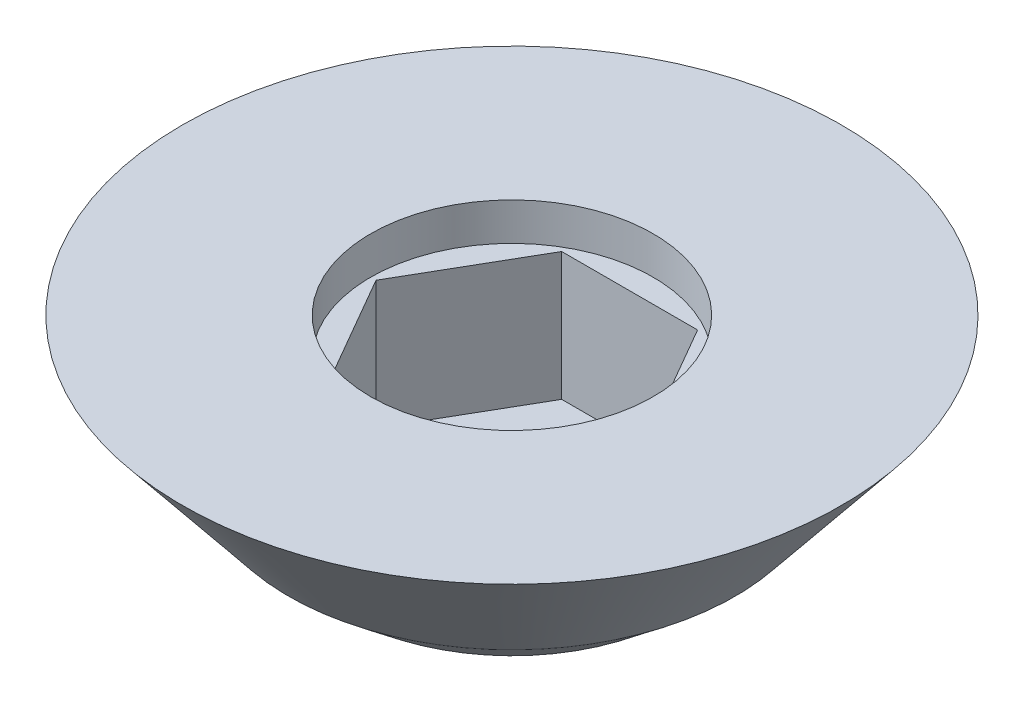
ISO-10303-21;
HEADER;
FILE_DESCRIPTION(('STEP AP214'),'2;1');
FILE_NAME('part.step','',(''),(''),'','','');
FILE_SCHEMA(('AUTOMOTIVE_DESIGN { 1 0 10303 214 1 1 1 1 }'));
ENDSEC;
DATA;
#1=APPLICATION_CONTEXT('core data for automotive mechanical design processes');
#2=APPLICATION_PROTOCOL_DEFINITION('international standard','automotive_design',2000,#1);
#3=PRODUCT_CONTEXT('',#1,'mechanical');
#4=PRODUCT('Part','Part','',(#3));
#5=PRODUCT_RELATED_PRODUCT_CATEGORY('part','',(#4));
#6=PRODUCT_DEFINITION_FORMATION('','',#4);
#7=PRODUCT_DEFINITION_CONTEXT('part definition',#1,'design');
#8=PRODUCT_DEFINITION('design','',#6,#7);
#9=PRODUCT_DEFINITION_SHAPE('','',#8);
#10=(LENGTH_UNIT() NAMED_UNIT(*) SI_UNIT(.MILLI.,.METRE.));
#11=(NAMED_UNIT(*) PLANE_ANGLE_UNIT() SI_UNIT($,.RADIAN.));
#12=(NAMED_UNIT(*) SI_UNIT($,.STERADIAN.) SOLID_ANGLE_UNIT());
#13=UNCERTAINTY_MEASURE_WITH_UNIT(LENGTH_MEASURE(1.E-05),#10,'distance_accuracy_value','');
#14=(GEOMETRIC_REPRESENTATION_CONTEXT(3) GLOBAL_UNCERTAINTY_ASSIGNED_CONTEXT((#13)) GLOBAL_UNIT_ASSIGNED_CONTEXT((#10,
#11,#12)) REPRESENTATION_CONTEXT('',''));
#15=CARTESIAN_POINT('',(0.,0.,0.));
#16=DIRECTION('',(0.,0.,1.));
#17=DIRECTION('',(1.,0.,0.));
#18=AXIS2_PLACEMENT_3D('',#15,#16,#17);
#19=CARTESIAN_POINT('',(-9.,0.,0.));
#20=DIRECTION('',(0.,-1.,0.));
#21=DIRECTION('',(1.,0.,0.));
#22=AXIS2_PLACEMENT_3D('',#19,#20,#21);
#23=PLANE('',#22);
#24=CARTESIAN_POINT('',(0.,0.,0.));
#25=DIRECTION('',(0.,1.,0.));
#26=DIRECTION('',(-1.,0.,0.));
#27=AXIS2_PLACEMENT_3D('',#24,#25,#26);
#28=CIRCLE('',#27,9.);
#29=CARTESIAN_POINT('',(-9.,0.,0.));
#30=VERTEX_POINT('',#29);
#31=EDGE_CURVE('E11',#30,#30,#28,.T.);
#32=ORIENTED_EDGE('',*,*,#31,.F.);
#33=EDGE_LOOP('',(#32));
#34=FACE_BOUND('',#33,.T.);
#35=ADVANCED_FACE('F36',(#34),#23,.T.);
#36=CARTESIAN_POINT('',(0.,2.29428264472203,0.));
#37=DIRECTION('',(0.,1.,0.));
#38=DIRECTION('',(-1.,0.,0.));
#39=AXIS2_PLACEMENT_3D('',#36,#37,#38);
#40=CONICAL_SURFACE('',#39,11.850227939292,0.893046146040094);
#41=ORIENTED_EDGE('',*,*,#31,.T.);
#42=EDGE_LOOP('',(#41));
#43=FACE_BOUND('',#42,.T.);
#44=CARTESIAN_POINT('',(0.,2.29428264472203,0.));
#45=DIRECTION('',(0.,1.,0.));
#46=DIRECTION('',(-1.,0.,0.));
#47=AXIS2_PLACEMENT_3D('',#44,#45,#46);
#48=CIRCLE('',#47,11.850227939292);
#49=CARTESIAN_POINT('',(-11.850227939292,2.29428264472203,0.));
#50=VERTEX_POINT('',#49);
#51=EDGE_CURVE('E43',#50,#50,#48,.T.);
#52=ORIENTED_EDGE('',*,*,#51,.F.);
#53=EDGE_LOOP('',(#52));
#54=FACE_BOUND('',#53,.T.);
#55=ADVANCED_FACE('F155',(#43,#54),#40,.T.);
#56=CARTESIAN_POINT('',(0.,9.3,0.));
#57=DIRECTION('',(0.,1.,0.));
#58=DIRECTION('',(-1.,0.,0.));
#59=AXIS2_PLACEMENT_3D('',#56,#57,#58);
#60=CONICAL_SURFACE('',#59,17.5,0.678662490748312);
#61=ORIENTED_EDGE('',*,*,#51,.T.);
#62=EDGE_LOOP('',(#61));
#63=FACE_BOUND('',#62,.T.);
#64=CARTESIAN_POINT('',(0.,9.3,0.));
#65=DIRECTION('',(0.,1.,0.));
#66=DIRECTION('',(-1.,0.,0.));
#67=AXIS2_PLACEMENT_3D('',#64,#65,#66);
#68=CIRCLE('',#67,17.5);
#69=CARTESIAN_POINT('',(-17.5,9.3,0.));
#70=VERTEX_POINT('',#69);
#71=EDGE_CURVE('E145',#70,#70,#68,.T.);
#72=ORIENTED_EDGE('',*,*,#71,.F.);
#73=EDGE_LOOP('',(#72));
#74=FACE_BOUND('',#73,.T.);
#75=ADVANCED_FACE('F152',(#63,#74),#60,.T.);
#76=CARTESIAN_POINT('',(-17.5,9.3,0.));
#77=DIRECTION('',(0.,1.,0.));
#78=DIRECTION('',(-1.,0.,0.));
#79=AXIS2_PLACEMENT_3D('',#76,#77,#78);
#80=PLANE('',#79);
#81=CARTESIAN_POINT('',(0.,9.3,0.));
#82=DIRECTION('',(0.,1.,0.));
#83=DIRECTION('',(0.,0.,1.));
#84=AXIS2_PLACEMENT_3D('',#81,#82,#83);
#85=CIRCLE('',#84,7.5);
#86=CARTESIAN_POINT('',(0.,9.3,7.5));
#87=VERTEX_POINT('',#86);
#88=EDGE_CURVE('E136',#87,#87,#85,.T.);
#89=ORIENTED_EDGE('',*,*,#88,.F.);
#90=EDGE_LOOP('',(#89));
#91=FACE_BOUND('',#90,.T.);
#92=ORIENTED_EDGE('',*,*,#71,.T.);
#93=EDGE_LOOP('',(#92));
#94=FACE_BOUND('',#93,.T.);
#95=ADVANCED_FACE('F162',(#91,#94),#80,.T.);
#96=CARTESIAN_POINT('',(0.,7.3,0.));
#97=DIRECTION('',(0.,1.,0.));
#98=DIRECTION('',(0.,0.,1.));
#99=AXIS2_PLACEMENT_3D('',#96,#97,#98);
#100=CYLINDRICAL_SURFACE('',#99,7.5);
#101=CARTESIAN_POINT('',(0.,7.3,0.));
#102=DIRECTION('',(0.,1.,0.));
#103=DIRECTION('',(0.,0.,1.));
#104=AXIS2_PLACEMENT_3D('',#101,#102,#103);
#105=CIRCLE('',#104,7.5);
#106=CARTESIAN_POINT('',(0.,7.3,7.5));
#107=VERTEX_POINT('',#106);
#108=EDGE_CURVE('E142',#107,#107,#105,.T.);
#109=ORIENTED_EDGE('',*,*,#108,.F.);
#110=EDGE_LOOP('',(#109));
#111=FACE_BOUND('',#110,.T.);
#112=ORIENTED_EDGE('',*,*,#88,.T.);
#113=EDGE_LOOP('',(#112));
#114=FACE_BOUND('',#113,.T.);
#115=ADVANCED_FACE('F168',(#111,#114),#100,.F.);
#116=CARTESIAN_POINT('',(0.,7.3,0.));
#117=DIRECTION('',(0.,1.,0.));
#118=DIRECTION('',(0.,0.,1.));
#119=AXIS2_PLACEMENT_3D('',#116,#117,#118);
#120=PLANE('',#119);
#121=DIRECTION('',(1.,0.,0.));
#122=VECTOR('',#121,1.);
#123=CARTESIAN_POINT('',(-3.60843918243516,7.3,6.25));
#124=LINE('',#123,#122);
#125=CARTESIAN_POINT('',(-3.60843918243516,7.3,6.25));
#126=VERTEX_POINT('',#125);
#127=CARTESIAN_POINT('',(3.60843918243516,7.3,6.25));
#128=VERTEX_POINT('',#127);
#129=EDGE_CURVE('E122',#126,#128,#124,.T.);
#130=ORIENTED_EDGE('',*,*,#129,.F.);
#131=DIRECTION('',(0.5,0.,0.866025403784438));
#132=VECTOR('',#131,1.);
#133=CARTESIAN_POINT('',(-7.21687836487032,7.3,0.));
#134=LINE('',#133,#132);
#135=CARTESIAN_POINT('',(-7.21687836487032,7.3,0.));
#136=VERTEX_POINT('',#135);
#137=EDGE_CURVE('E132',#136,#126,#134,.T.);
#138=ORIENTED_EDGE('',*,*,#137,.F.);
#139=DIRECTION('',(-0.5,0.,0.866025403784439));
#140=VECTOR('',#139,1.);
#141=CARTESIAN_POINT('',(-3.60843918243516,7.3,-6.25));
#142=LINE('',#141,#140);
#143=CARTESIAN_POINT('',(-3.60843918243516,7.3,-6.25));
#144=VERTEX_POINT('',#143);
#145=EDGE_CURVE('E50',#144,#136,#142,.T.);
#146=ORIENTED_EDGE('',*,*,#145,.F.);
#147=DIRECTION('',(-1.,0.,0.));
#148=VECTOR('',#147,1.);
#149=CARTESIAN_POINT('',(3.60843918243516,7.3,-6.25));
#150=LINE('',#149,#148);
#151=CARTESIAN_POINT('',(3.60843918243516,7.3,-6.25));
#152=VERTEX_POINT('',#151);
#153=EDGE_CURVE('E100',#152,#144,#150,.T.);
#154=ORIENTED_EDGE('',*,*,#153,.F.);
#155=DIRECTION('',(-0.5,0.,-0.866025403784439));
#156=VECTOR('',#155,1.);
#157=CARTESIAN_POINT('',(7.21687836487032,7.3,0.));
#158=LINE('',#157,#156);
#159=CARTESIAN_POINT('',(7.21687836487032,7.3,0.));
#160=VERTEX_POINT('',#159);
#161=EDGE_CURVE('E127',#160,#152,#158,.T.);
#162=ORIENTED_EDGE('',*,*,#161,.F.);
#163=DIRECTION('',(0.5,0.,-0.866025403784439));
#164=VECTOR('',#163,1.);
#165=CARTESIAN_POINT('',(3.60843918243516,7.3,6.25));
#166=LINE('',#165,#164);
#167=EDGE_CURVE('E124',#128,#160,#166,.T.);
#168=ORIENTED_EDGE('',*,*,#167,.F.);
#169=EDGE_LOOP('',(#130,#138,#146,#154,#162,#168));
#170=FACE_BOUND('',#169,.T.);
#171=ORIENTED_EDGE('',*,*,#108,.T.);
#172=EDGE_LOOP('',(#171));
#173=FACE_BOUND('',#172,.T.);
#174=ADVANCED_FACE('F172',(#170,#173),#120,.T.);
#175=CARTESIAN_POINT('',(-3.60843918243516,0.500000000000001,6.25));
#176=DIRECTION('',(0.,0.,1.));
#177=DIRECTION('',(1.,0.,0.));
#178=AXIS2_PLACEMENT_3D('',#175,#176,#177);
#179=PLANE('',#178);
#180=ORIENTED_EDGE('',*,*,#129,.T.);
#181=DIRECTION('',(0.,1.,0.));
#182=VECTOR('',#181,1.);
#183=CARTESIAN_POINT('',(3.60843918243516,0.500000000000001,6.25));
#184=LINE('',#183,#182);
#185=CARTESIAN_POINT('',(3.60843918243516,0.500000000000001,6.25));
#186=VERTEX_POINT('',#185);
#187=EDGE_CURVE('E82',#186,#128,#184,.T.);
#188=ORIENTED_EDGE('',*,*,#187,.F.);
#189=DIRECTION('',(1.,0.,0.));
#190=VECTOR('',#189,1.);
#191=CARTESIAN_POINT('',(-3.60843918243516,0.500000000000001,6.25));
#192=LINE('',#191,#190);
#193=CARTESIAN_POINT('',(-3.60843918243516,0.500000000000001,6.25));
#194=VERTEX_POINT('',#193);
#195=EDGE_CURVE('E134',#194,#186,#192,.T.);
#196=ORIENTED_EDGE('',*,*,#195,.F.);
#197=DIRECTION('',(0.,1.,0.));
#198=VECTOR('',#197,1.);
#199=CARTESIAN_POINT('',(-3.60843918243516,0.500000000000001,6.25));
#200=LINE('',#199,#198);
#201=EDGE_CURVE('E59',#194,#126,#200,.T.);
#202=ORIENTED_EDGE('',*,*,#201,.T.);
#203=EDGE_LOOP('',(#180,#188,#196,#202));
#204=FACE_BOUND('',#203,.T.);
#205=ADVANCED_FACE('F176',(#204),#179,.F.);
#206=CARTESIAN_POINT('',(-7.21687836487032,0.500000000000001,0.));
#207=DIRECTION('',(-0.866025403784439,0.,0.5));
#208=DIRECTION('',(0.5,0.,0.866025403784439));
#209=AXIS2_PLACEMENT_3D('',#206,#207,#208);
#210=PLANE('',#209);
#211=ORIENTED_EDGE('',*,*,#137,.T.);
#212=ORIENTED_EDGE('',*,*,#201,.F.);
#213=DIRECTION('',(0.5,0.,0.866025403784438));
#214=VECTOR('',#213,1.);
#215=CARTESIAN_POINT('',(-7.21687836487032,0.500000000000001,0.));
#216=LINE('',#215,#214);
#217=CARTESIAN_POINT('',(-7.21687836487032,0.500000000000001,0.));
#218=VERTEX_POINT('',#217);
#219=EDGE_CURVE('E109',#218,#194,#216,.T.);
#220=ORIENTED_EDGE('',*,*,#219,.F.);
#221=DIRECTION('',(0.,1.,0.));
#222=VECTOR('',#221,1.);
#223=CARTESIAN_POINT('',(-7.21687836487032,0.500000000000001,0.));
#224=LINE('',#223,#222);
#225=EDGE_CURVE('E101',#218,#136,#224,.T.);
#226=ORIENTED_EDGE('',*,*,#225,.T.);
#227=EDGE_LOOP('',(#211,#212,#220,#226));
#228=FACE_BOUND('',#227,.T.);
#229=ADVANCED_FACE('F180',(#228),#210,.F.);
#230=CARTESIAN_POINT('',(-3.60843918243516,0.500000000000001,-6.25));
#231=DIRECTION('',(-0.866025403784439,0.,-0.5));
#232=DIRECTION('',(-0.5,0.,0.866025403784439));
#233=AXIS2_PLACEMENT_3D('',#230,#231,#232);
#234=PLANE('',#233);
#235=ORIENTED_EDGE('',*,*,#145,.T.);
#236=ORIENTED_EDGE('',*,*,#225,.F.);
#237=DIRECTION('',(-0.5,0.,0.866025403784439));
#238=VECTOR('',#237,1.);
#239=CARTESIAN_POINT('',(-3.60843918243516,0.500000000000001,-6.25));
#240=LINE('',#239,#238);
#241=CARTESIAN_POINT('',(-3.60843918243516,0.500000000000001,-6.25));
#242=VERTEX_POINT('',#241);
#243=EDGE_CURVE('E105',#242,#218,#240,.T.);
#244=ORIENTED_EDGE('',*,*,#243,.F.);
#245=DIRECTION('',(0.,1.,0.));
#246=VECTOR('',#245,1.);
#247=CARTESIAN_POINT('',(-3.60843918243516,0.500000000000001,-6.25));
#248=LINE('',#247,#246);
#249=EDGE_CURVE('E93',#242,#144,#248,.T.);
#250=ORIENTED_EDGE('',*,*,#249,.T.);
#251=EDGE_LOOP('',(#235,#236,#244,#250));
#252=FACE_BOUND('',#251,.T.);
#253=ADVANCED_FACE('F106',(#252),#234,.F.);
#254=CARTESIAN_POINT('',(3.60843918243516,0.500000000000001,-6.25));
#255=DIRECTION('',(0.,0.,-1.));
#256=DIRECTION('',(-1.,0.,0.));
#257=AXIS2_PLACEMENT_3D('',#254,#255,#256);
#258=PLANE('',#257);
#259=ORIENTED_EDGE('',*,*,#153,.T.);
#260=ORIENTED_EDGE('',*,*,#249,.F.);
#261=DIRECTION('',(-1.,0.,0.));
#262=VECTOR('',#261,1.);
#263=CARTESIAN_POINT('',(3.60843918243516,0.500000000000001,-6.25));
#264=LINE('',#263,#262);
#265=CARTESIAN_POINT('',(3.60843918243516,0.500000000000001,-6.25));
#266=VERTEX_POINT('',#265);
#267=EDGE_CURVE('E97',#266,#242,#264,.T.);
#268=ORIENTED_EDGE('',*,*,#267,.F.);
#269=DIRECTION('',(0.,1.,0.));
#270=VECTOR('',#269,1.);
#271=CARTESIAN_POINT('',(3.60843918243516,0.500000000000001,-6.25));
#272=LINE('',#271,#270);
#273=EDGE_CURVE('E102',#266,#152,#272,.T.);
#274=ORIENTED_EDGE('',*,*,#273,.T.);
#275=EDGE_LOOP('',(#259,#260,#268,#274));
#276=FACE_BOUND('',#275,.T.);
#277=ADVANCED_FACE('F95',(#276),#258,.F.);
#278=CARTESIAN_POINT('',(7.21687836487032,0.500000000000001,0.));
#279=DIRECTION('',(0.866025403784439,0.,-0.5));
#280=DIRECTION('',(-0.5,0.,-0.866025403784439));
#281=AXIS2_PLACEMENT_3D('',#278,#279,#280);
#282=PLANE('',#281);
#283=ORIENTED_EDGE('',*,*,#161,.T.);
#284=ORIENTED_EDGE('',*,*,#273,.F.);
#285=DIRECTION('',(-0.5,0.,-0.866025403784439));
#286=VECTOR('',#285,1.);
#287=CARTESIAN_POINT('',(7.21687836487032,0.500000000000001,0.));
#288=LINE('',#287,#286);
#289=CARTESIAN_POINT('',(7.21687836487032,0.500000000000001,0.));
#290=VERTEX_POINT('',#289);
#291=EDGE_CURVE('E115',#290,#266,#288,.T.);
#292=ORIENTED_EDGE('',*,*,#291,.F.);
#293=DIRECTION('',(0.,1.,0.));
#294=VECTOR('',#293,1.);
#295=CARTESIAN_POINT('',(7.21687836487032,0.500000000000001,0.));
#296=LINE('',#295,#294);
#297=EDGE_CURVE('E139',#290,#160,#296,.T.);
#298=ORIENTED_EDGE('',*,*,#297,.T.);
#299=EDGE_LOOP('',(#283,#284,#292,#298));
#300=FACE_BOUND('',#299,.T.);
#301=ADVANCED_FACE('F184',(#300),#282,.F.);
#302=CARTESIAN_POINT('',(3.60843918243516,0.500000000000001,6.25));
#303=DIRECTION('',(0.866025403784439,0.,0.5));
#304=DIRECTION('',(0.5,0.,-0.866025403784439));
#305=AXIS2_PLACEMENT_3D('',#302,#303,#304);
#306=PLANE('',#305);
#307=ORIENTED_EDGE('',*,*,#167,.T.);
#308=ORIENTED_EDGE('',*,*,#297,.F.);
#309=DIRECTION('',(0.5,0.,-0.866025403784439));
#310=VECTOR('',#309,1.);
#311=CARTESIAN_POINT('',(3.60843918243516,0.500000000000001,6.25));
#312=LINE('',#311,#310);
#313=EDGE_CURVE('E117',#186,#290,#312,.T.);
#314=ORIENTED_EDGE('',*,*,#313,.F.);
#315=ORIENTED_EDGE('',*,*,#187,.T.);
#316=EDGE_LOOP('',(#307,#308,#314,#315));
#317=FACE_BOUND('',#316,.T.);
#318=ADVANCED_FACE('F181',(#317),#306,.F.);
#319=CARTESIAN_POINT('',(0.,0.500000000000001,0.));
#320=DIRECTION('',(0.,1.,0.));
#321=DIRECTION('',(0.,0.,1.));
#322=AXIS2_PLACEMENT_3D('',#319,#320,#321);
#323=PLANE('',#322);
#324=ORIENTED_EDGE('',*,*,#195,.T.);
#325=ORIENTED_EDGE('',*,*,#313,.T.);
#326=ORIENTED_EDGE('',*,*,#291,.T.);
#327=ORIENTED_EDGE('',*,*,#267,.T.);
#328=ORIENTED_EDGE('',*,*,#243,.T.);
#329=ORIENTED_EDGE('',*,*,#219,.T.);
#330=EDGE_LOOP('',(#324,#325,#326,#327,#328,#329));
#331=FACE_BOUND('',#330,.T.);
#332=ADVANCED_FACE('F112',(#331),#323,.T.);
#333=CLOSED_SHELL('',(#35,#55,#75,#95,#115,#174,#205,#229,#253,#277,#301,#318,#332));
#334=MANIFOLD_SOLID_BREP('B2',#333);
#335=ADVANCED_BREP_SHAPE_REPRESENTATION('',(#18,#334),#14);
#336=SHAPE_DEFINITION_REPRESENTATION(#9,#335);
ENDSEC;
END-ISO-10303-21;
